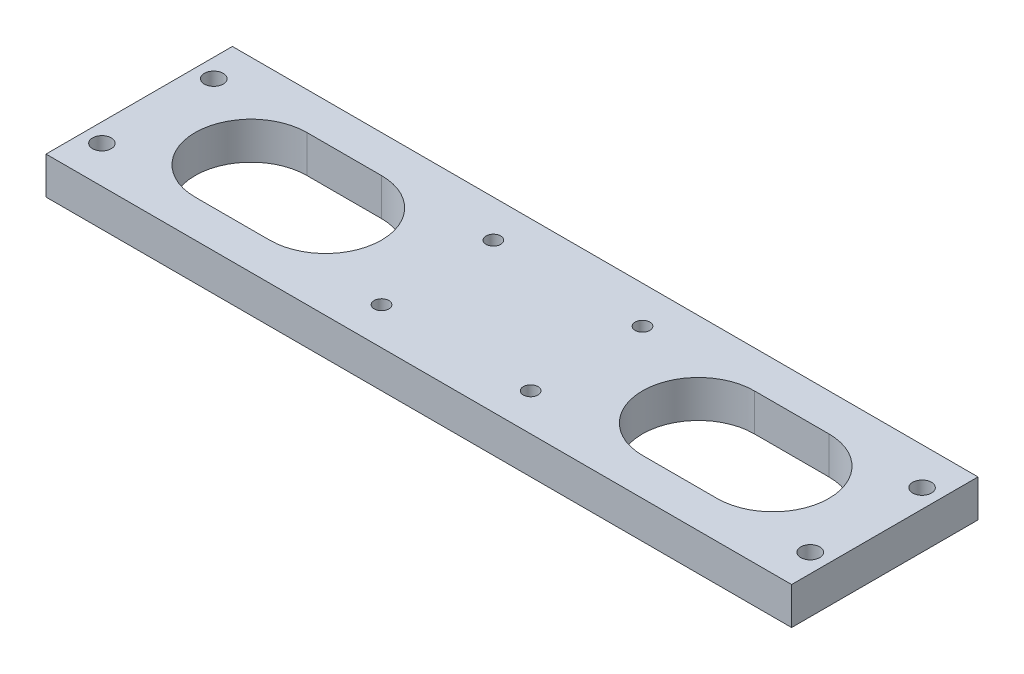
ISO-10303-21;
HEADER;
FILE_DESCRIPTION(('STEP AP214'),'2;1');
FILE_NAME('part.step','',(''),(''),'','','');
FILE_SCHEMA(('AUTOMOTIVE_DESIGN { 1 0 10303 214 1 1 1 1 }'));
ENDSEC;
DATA;
#1=APPLICATION_CONTEXT('core data for automotive mechanical design processes');
#2=APPLICATION_PROTOCOL_DEFINITION('international standard','automotive_design',2000,#1);
#3=PRODUCT_CONTEXT('',#1,'mechanical');
#4=PRODUCT('Part','Part','',(#3));
#5=PRODUCT_RELATED_PRODUCT_CATEGORY('part','',(#4));
#6=PRODUCT_DEFINITION_FORMATION('','',#4);
#7=PRODUCT_DEFINITION_CONTEXT('part definition',#1,'design');
#8=PRODUCT_DEFINITION('design','',#6,#7);
#9=PRODUCT_DEFINITION_SHAPE('','',#8);
#10=(LENGTH_UNIT() NAMED_UNIT(*) SI_UNIT(.MILLI.,.METRE.));
#11=(NAMED_UNIT(*) PLANE_ANGLE_UNIT() SI_UNIT($,.RADIAN.));
#12=(NAMED_UNIT(*) SI_UNIT($,.STERADIAN.) SOLID_ANGLE_UNIT());
#13=UNCERTAINTY_MEASURE_WITH_UNIT(LENGTH_MEASURE(1.E-05),#10,'distance_accuracy_value','');
#14=(GEOMETRIC_REPRESENTATION_CONTEXT(3) GLOBAL_UNCERTAINTY_ASSIGNED_CONTEXT((#13)) GLOBAL_UNIT_ASSIGNED_CONTEXT((#10,
#11,#12)) REPRESENTATION_CONTEXT('',''));
#15=CARTESIAN_POINT('',(0.,0.,0.));
#16=DIRECTION('',(0.,0.,1.));
#17=DIRECTION('',(1.,0.,0.));
#18=AXIS2_PLACEMENT_3D('',#15,#16,#17);
#19=CARTESIAN_POINT('',(0.,-3.175,0.));
#20=DIRECTION('',(0.,-1.,0.));
#21=DIRECTION('',(0.,0.,-1.));
#22=AXIS2_PLACEMENT_3D('',#19,#20,#21);
#23=PLANE('',#22);
#24=CARTESIAN_POINT('',(-44.45,-3.175,0.));
#25=DIRECTION('',(0.,1.,0.));
#26=DIRECTION('',(0.,0.,1.));
#27=AXIS2_PLACEMENT_3D('',#24,#25,#26);
#28=CIRCLE('',#27,9.525);
#29=CARTESIAN_POINT('',(-44.45,-3.175,-9.525));
#30=VERTEX_POINT('',#29);
#31=CARTESIAN_POINT('',(-44.45,-3.175,9.525));
#32=VERTEX_POINT('',#31);
#33=EDGE_CURVE('E135',#30,#32,#28,.T.);
#34=ORIENTED_EDGE('',*,*,#33,.T.);
#35=DIRECTION('',(1.,0.,0.));
#36=VECTOR('',#35,1.);
#37=CARTESIAN_POINT('',(-44.45,-3.175,9.525));
#38=LINE('',#37,#36);
#39=CARTESIAN_POINT('',(-31.75,-3.175,9.525));
#40=VERTEX_POINT('',#39);
#41=EDGE_CURVE('E146',#32,#40,#38,.T.);
#42=ORIENTED_EDGE('',*,*,#41,.T.);
#43=CARTESIAN_POINT('',(-31.75,-3.175,0.));
#44=DIRECTION('',(0.,1.,0.));
#45=DIRECTION('',(0.,0.,1.));
#46=AXIS2_PLACEMENT_3D('',#43,#44,#45);
#47=CIRCLE('',#46,9.525);
#48=CARTESIAN_POINT('',(-31.75,-3.175,-9.525));
#49=VERTEX_POINT('',#48);
#50=EDGE_CURVE('E57',#40,#49,#47,.T.);
#51=ORIENTED_EDGE('',*,*,#50,.T.);
#52=DIRECTION('',(-1.,0.,0.));
#53=VECTOR('',#52,1.);
#54=CARTESIAN_POINT('',(-44.45,-3.175,-9.525));
#55=LINE('',#54,#53);
#56=EDGE_CURVE('E143',#49,#30,#55,.T.);
#57=ORIENTED_EDGE('',*,*,#56,.T.);
#58=EDGE_LOOP('',(#34,#42,#51,#57));
#59=FACE_BOUND('',#58,.T.);
#60=CARTESIAN_POINT('',(44.45,-3.175,0.));
#61=DIRECTION('',(0.,1.,0.));
#62=DIRECTION('',(0.,0.,1.));
#63=AXIS2_PLACEMENT_3D('',#60,#61,#62);
#64=CIRCLE('',#63,9.525);
#65=CARTESIAN_POINT('',(44.45,-3.175,9.525));
#66=VERTEX_POINT('',#65);
#67=CARTESIAN_POINT('',(44.45,-3.175,-9.52500000000001));
#68=VERTEX_POINT('',#67);
#69=EDGE_CURVE('E172',#66,#68,#64,.T.);
#70=ORIENTED_EDGE('',*,*,#69,.T.);
#71=DIRECTION('',(-1.,0.,0.));
#72=VECTOR('',#71,1.);
#73=CARTESIAN_POINT('',(44.45,-3.175,-9.52500000000001));
#74=LINE('',#73,#72);
#75=CARTESIAN_POINT('',(31.75,-3.175,-9.525));
#76=VERTEX_POINT('',#75);
#77=EDGE_CURVE('E175',#68,#76,#74,.T.);
#78=ORIENTED_EDGE('',*,*,#77,.T.);
#79=CARTESIAN_POINT('',(31.75,-3.175,0.));
#80=DIRECTION('',(0.,1.,0.));
#81=DIRECTION('',(0.,0.,1.));
#82=AXIS2_PLACEMENT_3D('',#79,#80,#81);
#83=CIRCLE('',#82,9.525);
#84=CARTESIAN_POINT('',(31.75,-3.175,9.525));
#85=VERTEX_POINT('',#84);
#86=EDGE_CURVE('E65',#76,#85,#83,.T.);
#87=ORIENTED_EDGE('',*,*,#86,.T.);
#88=DIRECTION('',(1.,0.,0.));
#89=VECTOR('',#88,1.);
#90=CARTESIAN_POINT('',(44.45,-3.175,9.525));
#91=LINE('',#90,#89);
#92=EDGE_CURVE('E180',#85,#66,#91,.T.);
#93=ORIENTED_EDGE('',*,*,#92,.T.);
#94=EDGE_LOOP('',(#70,#78,#87,#93));
#95=FACE_BOUND('',#94,.T.);
#96=CARTESIAN_POINT('',(-12.7,-3.175,-9.525));
#97=DIRECTION('',(0.,1.,0.));
#98=DIRECTION('',(0.,0.,1.));
#99=AXIS2_PLACEMENT_3D('',#96,#97,#98);
#100=CIRCLE('',#99,1.25);
#101=CARTESIAN_POINT('',(-12.7,-3.175,-8.275));
#102=VERTEX_POINT('',#101);
#103=EDGE_CURVE('E203',#102,#102,#100,.T.);
#104=ORIENTED_EDGE('',*,*,#103,.T.);
#105=EDGE_LOOP('',(#104));
#106=FACE_BOUND('',#105,.T.);
#107=CARTESIAN_POINT('',(12.7,-3.175,-9.525));
#108=DIRECTION('',(0.,1.,0.));
#109=DIRECTION('',(0.,0.,1.));
#110=AXIS2_PLACEMENT_3D('',#107,#108,#109);
#111=CIRCLE('',#110,1.25);
#112=CARTESIAN_POINT('',(12.7,-3.175,-8.275));
#113=VERTEX_POINT('',#112);
#114=EDGE_CURVE('E209',#113,#113,#111,.T.);
#115=ORIENTED_EDGE('',*,*,#114,.T.);
#116=EDGE_LOOP('',(#115));
#117=FACE_BOUND('',#116,.T.);
#118=DIRECTION('',(0.,0.,-1.));
#119=VECTOR('',#118,1.);
#120=CARTESIAN_POINT('',(63.5,-3.175,15.875));
#121=LINE('',#120,#119);
#122=CARTESIAN_POINT('',(63.5,-3.175,15.875));
#123=VERTEX_POINT('',#122);
#124=CARTESIAN_POINT('',(63.5,-3.175,-15.875));
#125=VERTEX_POINT('',#124);
#126=EDGE_CURVE('E262',#123,#125,#121,.T.);
#127=ORIENTED_EDGE('',*,*,#126,.F.);
#128=DIRECTION('',(1.,0.,0.));
#129=VECTOR('',#128,1.);
#130=CARTESIAN_POINT('',(-63.5,-3.175,15.875));
#131=LINE('',#130,#129);
#132=CARTESIAN_POINT('',(-63.5,-3.175,15.875));
#133=VERTEX_POINT('',#132);
#134=EDGE_CURVE('E255',#133,#123,#131,.T.);
#135=ORIENTED_EDGE('',*,*,#134,.F.);
#136=DIRECTION('',(0.,0.,1.));
#137=VECTOR('',#136,1.);
#138=CARTESIAN_POINT('',(-63.5,-3.175,15.875));
#139=LINE('',#138,#137);
#140=CARTESIAN_POINT('',(-63.5,-3.175,-15.875));
#141=VERTEX_POINT('',#140);
#142=EDGE_CURVE('E267',#141,#133,#139,.T.);
#143=ORIENTED_EDGE('',*,*,#142,.F.);
#144=DIRECTION('',(-1.,0.,0.));
#145=VECTOR('',#144,1.);
#146=CARTESIAN_POINT('',(-63.5,-3.175,-15.875));
#147=LINE('',#146,#145);
#148=EDGE_CURVE('E265',#125,#141,#147,.T.);
#149=ORIENTED_EDGE('',*,*,#148,.F.);
#150=EDGE_LOOP('',(#127,#135,#143,#149));
#151=FACE_BOUND('',#150,.T.);
#152=CARTESIAN_POINT('',(60.325,-3.175,-9.52499999999997));
#153=DIRECTION('',(0.,-1.,0.));
#154=DIRECTION('',(0.,0.,-1.));
#155=AXIS2_PLACEMENT_3D('',#152,#153,#154);
#156=CIRCLE('',#155,3.15);
#157=CARTESIAN_POINT('',(60.325,-3.175,-12.675));
#158=VERTEX_POINT('',#157);
#159=EDGE_CURVE('E244',#158,#158,#156,.T.);
#160=ORIENTED_EDGE('',*,*,#159,.F.);
#161=EDGE_LOOP('',(#160));
#162=FACE_BOUND('',#161,.T.);
#163=CARTESIAN_POINT('',(60.325,-3.175,9.52500000000003));
#164=DIRECTION('',(0.,-1.,0.));
#165=DIRECTION('',(0.,0.,-1.));
#166=AXIS2_PLACEMENT_3D('',#163,#164,#165);
#167=CIRCLE('',#166,3.15000000000001);
#168=CARTESIAN_POINT('',(60.325,-3.175,6.37500000000003));
#169=VERTEX_POINT('',#168);
#170=EDGE_CURVE('E237',#169,#169,#167,.T.);
#171=ORIENTED_EDGE('',*,*,#170,.F.);
#172=EDGE_LOOP('',(#171));
#173=FACE_BOUND('',#172,.T.);
#174=CARTESIAN_POINT('',(-60.325,-3.175,9.52499999999998));
#175=DIRECTION('',(0.,-1.,0.));
#176=DIRECTION('',(0.,0.,-1.));
#177=AXIS2_PLACEMENT_3D('',#174,#175,#176);
#178=CIRCLE('',#177,3.15);
#179=CARTESIAN_POINT('',(-60.325,-3.175,6.37499999999998));
#180=VERTEX_POINT('',#179);
#181=EDGE_CURVE('E230',#180,#180,#178,.T.);
#182=ORIENTED_EDGE('',*,*,#181,.F.);
#183=EDGE_LOOP('',(#182));
#184=FACE_BOUND('',#183,.T.);
#185=CARTESIAN_POINT('',(-60.325,-3.175,-9.52500000000003));
#186=DIRECTION('',(0.,-1.,0.));
#187=DIRECTION('',(0.,0.,-1.));
#188=AXIS2_PLACEMENT_3D('',#185,#186,#187);
#189=CIRCLE('',#188,3.15);
#190=CARTESIAN_POINT('',(-60.325,-3.175,-12.675));
#191=VERTEX_POINT('',#190);
#192=EDGE_CURVE('E224',#191,#191,#189,.T.);
#193=ORIENTED_EDGE('',*,*,#192,.F.);
#194=EDGE_LOOP('',(#193));
#195=FACE_BOUND('',#194,.T.);
#196=CARTESIAN_POINT('',(-12.7,-3.175,9.525));
#197=DIRECTION('',(0.,1.,0.));
#198=DIRECTION('',(0.,0.,1.));
#199=AXIS2_PLACEMENT_3D('',#196,#197,#198);
#200=CIRCLE('',#199,1.25);
#201=CARTESIAN_POINT('',(-12.7,-3.175,10.775));
#202=VERTEX_POINT('',#201);
#203=EDGE_CURVE('E221',#202,#202,#200,.T.);
#204=ORIENTED_EDGE('',*,*,#203,.T.);
#205=EDGE_LOOP('',(#204));
#206=FACE_BOUND('',#205,.T.);
#207=CARTESIAN_POINT('',(12.7,-3.175,9.525));
#208=DIRECTION('',(0.,1.,0.));
#209=DIRECTION('',(0.,0.,1.));
#210=AXIS2_PLACEMENT_3D('',#207,#208,#209);
#211=CIRCLE('',#210,1.25);
#212=CARTESIAN_POINT('',(12.7,-3.175,10.775));
#213=VERTEX_POINT('',#212);
#214=EDGE_CURVE('E215',#213,#213,#211,.T.);
#215=ORIENTED_EDGE('',*,*,#214,.T.);
#216=EDGE_LOOP('',(#215));
#217=FACE_BOUND('',#216,.T.);
#218=ADVANCED_FACE('F40',(#59,#95,#106,#117,#151,#162,#173,#184,#195,#206,#217),#23,.T.);
#219=CARTESIAN_POINT('',(63.5,3.175,15.875));
#220=DIRECTION('',(-1.,0.,0.));
#221=DIRECTION('',(0.,0.,1.));
#222=AXIS2_PLACEMENT_3D('',#219,#220,#221);
#223=PLANE('',#222);
#224=ORIENTED_EDGE('',*,*,#126,.T.);
#225=DIRECTION('',(0.,-1.,0.));
#226=VECTOR('',#225,1.);
#227=CARTESIAN_POINT('',(63.5,3.175,-15.875));
#228=LINE('',#227,#226);
#229=CARTESIAN_POINT('',(63.5,3.175,-15.875));
#230=VERTEX_POINT('',#229);
#231=EDGE_CURVE('E11',#230,#125,#228,.T.);
#232=ORIENTED_EDGE('',*,*,#231,.F.);
#233=DIRECTION('',(0.,0.,-1.));
#234=VECTOR('',#233,1.);
#235=CARTESIAN_POINT('',(63.5,3.175,15.875));
#236=LINE('',#235,#234);
#237=CARTESIAN_POINT('',(63.5,3.175,15.875));
#238=VERTEX_POINT('',#237);
#239=EDGE_CURVE('E251',#238,#230,#236,.T.);
#240=ORIENTED_EDGE('',*,*,#239,.F.);
#241=DIRECTION('',(0.,-1.,0.));
#242=VECTOR('',#241,1.);
#243=CARTESIAN_POINT('',(63.5,3.175,15.875));
#244=LINE('',#243,#242);
#245=EDGE_CURVE('E261',#238,#123,#244,.T.);
#246=ORIENTED_EDGE('',*,*,#245,.T.);
#247=EDGE_LOOP('',(#224,#232,#240,#246));
#248=FACE_BOUND('',#247,.T.);
#249=ADVANCED_FACE('F42',(#248),#223,.F.);
#250=CARTESIAN_POINT('',(-63.5,3.175,-15.875));
#251=DIRECTION('',(0.,0.,1.));
#252=DIRECTION('',(1.,0.,0.));
#253=AXIS2_PLACEMENT_3D('',#250,#251,#252);
#254=PLANE('',#253);
#255=ORIENTED_EDGE('',*,*,#148,.T.);
#256=DIRECTION('',(0.,-1.,0.));
#257=VECTOR('',#256,1.);
#258=CARTESIAN_POINT('',(-63.5,3.175,-15.875));
#259=LINE('',#258,#257);
#260=CARTESIAN_POINT('',(-63.5,3.175,-15.875));
#261=VERTEX_POINT('',#260);
#262=EDGE_CURVE('E49',#261,#141,#259,.T.);
#263=ORIENTED_EDGE('',*,*,#262,.F.);
#264=DIRECTION('',(-1.,0.,0.));
#265=VECTOR('',#264,1.);
#266=CARTESIAN_POINT('',(-63.5,3.175,-15.875));
#267=LINE('',#266,#265);
#268=EDGE_CURVE('E254',#230,#261,#267,.T.);
#269=ORIENTED_EDGE('',*,*,#268,.F.);
#270=ORIENTED_EDGE('',*,*,#231,.T.);
#271=EDGE_LOOP('',(#255,#263,#269,#270));
#272=FACE_BOUND('',#271,.T.);
#273=ADVANCED_FACE('F307',(#272),#254,.F.);
#274=CARTESIAN_POINT('',(-63.5,3.175,15.875));
#275=DIRECTION('',(1.,0.,0.));
#276=DIRECTION('',(0.,0.,-1.));
#277=AXIS2_PLACEMENT_3D('',#274,#275,#276);
#278=PLANE('',#277);
#279=ORIENTED_EDGE('',*,*,#142,.T.);
#280=DIRECTION('',(0.,-1.,0.));
#281=VECTOR('',#280,1.);
#282=CARTESIAN_POINT('',(-63.5,3.175,15.875));
#283=LINE('',#282,#281);
#284=CARTESIAN_POINT('',(-63.5,3.175,15.875));
#285=VERTEX_POINT('',#284);
#286=EDGE_CURVE('E272',#285,#133,#283,.T.);
#287=ORIENTED_EDGE('',*,*,#286,.F.);
#288=DIRECTION('',(0.,0.,1.));
#289=VECTOR('',#288,1.);
#290=CARTESIAN_POINT('',(-63.5,3.175,15.875));
#291=LINE('',#290,#289);
#292=EDGE_CURVE('E257',#261,#285,#291,.T.);
#293=ORIENTED_EDGE('',*,*,#292,.F.);
#294=ORIENTED_EDGE('',*,*,#262,.T.);
#295=EDGE_LOOP('',(#279,#287,#293,#294));
#296=FACE_BOUND('',#295,.T.);
#297=ADVANCED_FACE('F315',(#296),#278,.F.);
#298=CARTESIAN_POINT('',(-63.5,3.175,15.875));
#299=DIRECTION('',(0.,0.,-1.));
#300=DIRECTION('',(-1.,0.,0.));
#301=AXIS2_PLACEMENT_3D('',#298,#299,#300);
#302=PLANE('',#301);
#303=ORIENTED_EDGE('',*,*,#134,.T.);
#304=ORIENTED_EDGE('',*,*,#245,.F.);
#305=DIRECTION('',(1.,0.,0.));
#306=VECTOR('',#305,1.);
#307=CARTESIAN_POINT('',(-63.5,3.175,15.875));
#308=LINE('',#307,#306);
#309=EDGE_CURVE('E259',#285,#238,#308,.T.);
#310=ORIENTED_EDGE('',*,*,#309,.F.);
#311=ORIENTED_EDGE('',*,*,#286,.T.);
#312=EDGE_LOOP('',(#303,#304,#310,#311));
#313=FACE_BOUND('',#312,.T.);
#314=ADVANCED_FACE('F312',(#313),#302,.F.);
#315=CARTESIAN_POINT('',(0.,3.175,0.));
#316=DIRECTION('',(0.,-1.,0.));
#317=DIRECTION('',(0.,0.,-1.));
#318=AXIS2_PLACEMENT_3D('',#315,#316,#317);
#319=PLANE('',#318);
#320=DIRECTION('',(1.,0.,0.));
#321=VECTOR('',#320,1.);
#322=CARTESIAN_POINT('',(-44.45,3.175,9.525));
#323=LINE('',#322,#321);
#324=CARTESIAN_POINT('',(-44.45,3.175,9.525));
#325=VERTEX_POINT('',#324);
#326=CARTESIAN_POINT('',(-31.75,3.175,9.525));
#327=VERTEX_POINT('',#326);
#328=EDGE_CURVE('E161',#325,#327,#323,.T.);
#329=ORIENTED_EDGE('',*,*,#328,.F.);
#330=CARTESIAN_POINT('',(-44.45,3.175,0.));
#331=DIRECTION('',(0.,1.,0.));
#332=DIRECTION('',(0.,0.,1.));
#333=AXIS2_PLACEMENT_3D('',#330,#331,#332);
#334=CIRCLE('',#333,9.525);
#335=CARTESIAN_POINT('',(-44.45,3.175,-9.525));
#336=VERTEX_POINT('',#335);
#337=EDGE_CURVE('E138',#336,#325,#334,.T.);
#338=ORIENTED_EDGE('',*,*,#337,.F.);
#339=DIRECTION('',(-1.,0.,0.));
#340=VECTOR('',#339,1.);
#341=CARTESIAN_POINT('',(-44.45,3.175,-9.525));
#342=LINE('',#341,#340);
#343=CARTESIAN_POINT('',(-31.75,3.175,-9.525));
#344=VERTEX_POINT('',#343);
#345=EDGE_CURVE('E152',#344,#336,#342,.T.);
#346=ORIENTED_EDGE('',*,*,#345,.F.);
#347=CARTESIAN_POINT('',(-31.75,3.175,0.));
#348=DIRECTION('',(0.,1.,0.));
#349=DIRECTION('',(0.,0.,1.));
#350=AXIS2_PLACEMENT_3D('',#347,#348,#349);
#351=CIRCLE('',#350,9.525);
#352=EDGE_CURVE('E155',#327,#344,#351,.T.);
#353=ORIENTED_EDGE('',*,*,#352,.F.);
#354=EDGE_LOOP('',(#329,#338,#346,#353));
#355=FACE_BOUND('',#354,.T.);
#356=DIRECTION('',(-1.,0.,0.));
#357=VECTOR('',#356,1.);
#358=CARTESIAN_POINT('',(44.45,3.175,-9.52500000000001));
#359=LINE('',#358,#357);
#360=CARTESIAN_POINT('',(44.45,3.175,-9.52500000000001));
#361=VERTEX_POINT('',#360);
#362=CARTESIAN_POINT('',(31.75,3.175,-9.525));
#363=VERTEX_POINT('',#362);
#364=EDGE_CURVE('E186',#361,#363,#359,.T.);
#365=ORIENTED_EDGE('',*,*,#364,.F.);
#366=CARTESIAN_POINT('',(44.45,3.175,0.));
#367=DIRECTION('',(0.,1.,0.));
#368=DIRECTION('',(0.,0.,1.));
#369=AXIS2_PLACEMENT_3D('',#366,#367,#368);
#370=CIRCLE('',#369,9.525);
#371=CARTESIAN_POINT('',(44.45,3.175,9.525));
#372=VERTEX_POINT('',#371);
#373=EDGE_CURVE('E184',#372,#361,#370,.T.);
#374=ORIENTED_EDGE('',*,*,#373,.F.);
#375=DIRECTION('',(1.,0.,0.));
#376=VECTOR('',#375,1.);
#377=CARTESIAN_POINT('',(44.45,3.175,9.525));
#378=LINE('',#377,#376);
#379=CARTESIAN_POINT('',(31.75,3.175,9.525));
#380=VERTEX_POINT('',#379);
#381=EDGE_CURVE('E176',#380,#372,#378,.T.);
#382=ORIENTED_EDGE('',*,*,#381,.F.);
#383=CARTESIAN_POINT('',(31.75,3.175,0.));
#384=DIRECTION('',(0.,1.,0.));
#385=DIRECTION('',(0.,0.,1.));
#386=AXIS2_PLACEMENT_3D('',#383,#384,#385);
#387=CIRCLE('',#386,9.525);
#388=EDGE_CURVE('E189',#363,#380,#387,.T.);
#389=ORIENTED_EDGE('',*,*,#388,.F.);
#390=EDGE_LOOP('',(#365,#374,#382,#389));
#391=FACE_BOUND('',#390,.T.);
#392=CARTESIAN_POINT('',(-12.7,3.175,-9.525));
#393=DIRECTION('',(0.,1.,0.));
#394=DIRECTION('',(0.,0.,1.));
#395=AXIS2_PLACEMENT_3D('',#392,#393,#394);
#396=CIRCLE('',#395,1.24999999999999);
#397=CARTESIAN_POINT('',(-12.7,3.175,-8.27500000000001));
#398=VERTEX_POINT('',#397);
#399=EDGE_CURVE('E168',#398,#398,#396,.T.);
#400=ORIENTED_EDGE('',*,*,#399,.F.);
#401=EDGE_LOOP('',(#400));
#402=FACE_BOUND('',#401,.T.);
#403=CARTESIAN_POINT('',(12.7,3.175,-9.525));
#404=DIRECTION('',(0.,1.,0.));
#405=DIRECTION('',(0.,0.,1.));
#406=AXIS2_PLACEMENT_3D('',#403,#404,#405);
#407=CIRCLE('',#406,1.24999999999999);
#408=CARTESIAN_POINT('',(12.7,3.175,-8.27500000000001));
#409=VERTEX_POINT('',#408);
#410=EDGE_CURVE('E206',#409,#409,#407,.T.);
#411=ORIENTED_EDGE('',*,*,#410,.F.);
#412=EDGE_LOOP('',(#411));
#413=FACE_BOUND('',#412,.T.);
#414=CARTESIAN_POINT('',(12.7,3.175,9.525));
#415=DIRECTION('',(0.,1.,0.));
#416=DIRECTION('',(0.,0.,1.));
#417=AXIS2_PLACEMENT_3D('',#414,#415,#416);
#418=CIRCLE('',#417,1.24999999999999);
#419=CARTESIAN_POINT('',(12.7,3.175,10.775));
#420=VERTEX_POINT('',#419);
#421=EDGE_CURVE('E212',#420,#420,#418,.T.);
#422=ORIENTED_EDGE('',*,*,#421,.F.);
#423=EDGE_LOOP('',(#422));
#424=FACE_BOUND('',#423,.T.);
#425=CARTESIAN_POINT('',(-12.7,3.175,9.525));
#426=DIRECTION('',(0.,1.,0.));
#427=DIRECTION('',(0.,0.,1.));
#428=AXIS2_PLACEMENT_3D('',#425,#426,#427);
#429=CIRCLE('',#428,1.24999999999999);
#430=CARTESIAN_POINT('',(-12.7,3.175,10.775));
#431=VERTEX_POINT('',#430);
#432=EDGE_CURVE('E218',#431,#431,#429,.T.);
#433=ORIENTED_EDGE('',*,*,#432,.F.);
#434=EDGE_LOOP('',(#433));
#435=FACE_BOUND('',#434,.T.);
#436=CARTESIAN_POINT('',(-60.325,3.175,-9.52500000000003));
#437=DIRECTION('',(0.,-1.,0.));
#438=DIRECTION('',(0.,0.,-1.));
#439=AXIS2_PLACEMENT_3D('',#436,#437,#438);
#440=CIRCLE('',#439,1.6);
#441=CARTESIAN_POINT('',(-60.325,3.175,-11.125));
#442=VERTEX_POINT('',#441);
#443=EDGE_CURVE('E44',#442,#442,#440,.T.);
#444=ORIENTED_EDGE('',*,*,#443,.T.);
#445=EDGE_LOOP('',(#444));
#446=FACE_BOUND('',#445,.T.);
#447=CARTESIAN_POINT('',(-60.325,3.175,9.52499999999998));
#448=DIRECTION('',(0.,-1.,0.));
#449=DIRECTION('',(0.,0.,-1.));
#450=AXIS2_PLACEMENT_3D('',#447,#448,#449);
#451=CIRCLE('',#450,1.6);
#452=CARTESIAN_POINT('',(-60.325,3.175,7.92499999999998));
#453=VERTEX_POINT('',#452);
#454=EDGE_CURVE('E236',#453,#453,#451,.T.);
#455=ORIENTED_EDGE('',*,*,#454,.T.);
#456=EDGE_LOOP('',(#455));
#457=FACE_BOUND('',#456,.T.);
#458=CARTESIAN_POINT('',(60.325,3.175,9.52500000000003));
#459=DIRECTION('',(0.,-1.,0.));
#460=DIRECTION('',(0.,0.,-1.));
#461=AXIS2_PLACEMENT_3D('',#458,#459,#460);
#462=CIRCLE('',#461,1.6);
#463=CARTESIAN_POINT('',(60.325,3.175,7.92500000000004));
#464=VERTEX_POINT('',#463);
#465=EDGE_CURVE('E243',#464,#464,#462,.T.);
#466=ORIENTED_EDGE('',*,*,#465,.T.);
#467=EDGE_LOOP('',(#466));
#468=FACE_BOUND('',#467,.T.);
#469=CARTESIAN_POINT('',(60.325,3.175,-9.52499999999997));
#470=DIRECTION('',(0.,-1.,0.));
#471=DIRECTION('',(0.,0.,-1.));
#472=AXIS2_PLACEMENT_3D('',#469,#470,#471);
#473=CIRCLE('',#472,1.6);
#474=CARTESIAN_POINT('',(60.325,3.175,-11.125));
#475=VERTEX_POINT('',#474);
#476=EDGE_CURVE('E250',#475,#475,#473,.T.);
#477=ORIENTED_EDGE('',*,*,#476,.T.);
#478=EDGE_LOOP('',(#477));
#479=FACE_BOUND('',#478,.T.);
#480=ORIENTED_EDGE('',*,*,#239,.T.);
#481=ORIENTED_EDGE('',*,*,#268,.T.);
#482=ORIENTED_EDGE('',*,*,#292,.T.);
#483=ORIENTED_EDGE('',*,*,#309,.T.);
#484=EDGE_LOOP('',(#480,#481,#482,#483));
#485=FACE_BOUND('',#484,.T.);
#486=ADVANCED_FACE('F283',(#355,#391,#402,#413,#424,#435,#446,#457,#468,#479,#485),#319,.F.);
#487=CARTESIAN_POINT('',(60.325,-3.175,-9.52499999999997));
#488=DIRECTION('',(0.,-1.,0.));
#489=DIRECTION('',(0.,0.,-1.));
#490=AXIS2_PLACEMENT_3D('',#487,#488,#489);
#491=CYLINDRICAL_SURFACE('',#490,1.6);
#492=CARTESIAN_POINT('',(60.325,-1.625,-9.52499999999997));
#493=DIRECTION('',(0.,-1.,0.));
#494=DIRECTION('',(0.,0.,-1.));
#495=AXIS2_PLACEMENT_3D('',#492,#493,#494);
#496=CIRCLE('',#495,1.6);
#497=CARTESIAN_POINT('',(60.325,-1.625,-11.125));
#498=VERTEX_POINT('',#497);
#499=EDGE_CURVE('E247',#498,#498,#496,.T.);
#500=ORIENTED_EDGE('',*,*,#499,.T.);
#501=EDGE_LOOP('',(#500));
#502=FACE_BOUND('',#501,.T.);
#503=ORIENTED_EDGE('',*,*,#476,.F.);
#504=EDGE_LOOP('',(#503));
#505=FACE_BOUND('',#504,.T.);
#506=ADVANCED_FACE('F337',(#502,#505),#491,.F.);
#507=CARTESIAN_POINT('',(60.325,-3.175,-9.52499999999997));
#508=DIRECTION('',(0.,-1.,0.));
#509=DIRECTION('',(0.,0.,-1.));
#510=AXIS2_PLACEMENT_3D('',#507,#508,#509);
#511=CONICAL_SURFACE('',#510,3.15,0.785398163397448);
#512=ORIENTED_EDGE('',*,*,#499,.F.);
#513=EDGE_LOOP('',(#512));
#514=FACE_BOUND('',#513,.T.);
#515=ORIENTED_EDGE('',*,*,#159,.T.);
#516=EDGE_LOOP('',(#515));
#517=FACE_BOUND('',#516,.T.);
#518=ADVANCED_FACE('F342',(#514,#517),#511,.F.);
#519=CARTESIAN_POINT('',(60.325,-3.175,9.52500000000003));
#520=DIRECTION('',(0.,-1.,0.));
#521=DIRECTION('',(0.,0.,-1.));
#522=AXIS2_PLACEMENT_3D('',#519,#520,#521);
#523=CYLINDRICAL_SURFACE('',#522,1.6);
#524=CARTESIAN_POINT('',(60.325,-1.625,9.52500000000003));
#525=DIRECTION('',(0.,-1.,0.));
#526=DIRECTION('',(0.,0.,-1.));
#527=AXIS2_PLACEMENT_3D('',#524,#525,#526);
#528=CIRCLE('',#527,1.6);
#529=CARTESIAN_POINT('',(60.325,-1.625,7.92500000000004));
#530=VERTEX_POINT('',#529);
#531=EDGE_CURVE('E240',#530,#530,#528,.T.);
#532=ORIENTED_EDGE('',*,*,#531,.T.);
#533=EDGE_LOOP('',(#532));
#534=FACE_BOUND('',#533,.T.);
#535=ORIENTED_EDGE('',*,*,#465,.F.);
#536=EDGE_LOOP('',(#535));
#537=FACE_BOUND('',#536,.T.);
#538=ADVANCED_FACE('F299',(#534,#537),#523,.F.);
#539=CARTESIAN_POINT('',(60.325,-3.175,9.52500000000003));
#540=DIRECTION('',(0.,-1.,0.));
#541=DIRECTION('',(0.,0.,-1.));
#542=AXIS2_PLACEMENT_3D('',#539,#540,#541);
#543=CONICAL_SURFACE('',#542,3.15000000000001,0.78539816339745);
#544=ORIENTED_EDGE('',*,*,#531,.F.);
#545=EDGE_LOOP('',(#544));
#546=FACE_BOUND('',#545,.T.);
#547=ORIENTED_EDGE('',*,*,#170,.T.);
#548=EDGE_LOOP('',(#547));
#549=FACE_BOUND('',#548,.T.);
#550=ADVANCED_FACE('F289',(#546,#549),#543,.F.);
#551=CARTESIAN_POINT('',(-60.325,-3.175,9.52499999999998));
#552=DIRECTION('',(0.,-1.,0.));
#553=DIRECTION('',(0.,0.,-1.));
#554=AXIS2_PLACEMENT_3D('',#551,#552,#553);
#555=CYLINDRICAL_SURFACE('',#554,1.6);
#556=CARTESIAN_POINT('',(-60.325,-1.625,9.52499999999998));
#557=DIRECTION('',(0.,-1.,0.));
#558=DIRECTION('',(0.,0.,-1.));
#559=AXIS2_PLACEMENT_3D('',#556,#557,#558);
#560=CIRCLE('',#559,1.6);
#561=CARTESIAN_POINT('',(-60.325,-1.625,7.92499999999998));
#562=VERTEX_POINT('',#561);
#563=EDGE_CURVE('E233',#562,#562,#560,.T.);
#564=ORIENTED_EDGE('',*,*,#563,.T.);
#565=EDGE_LOOP('',(#564));
#566=FACE_BOUND('',#565,.T.);
#567=ORIENTED_EDGE('',*,*,#454,.F.);
#568=EDGE_LOOP('',(#567));
#569=FACE_BOUND('',#568,.T.);
#570=ADVANCED_FACE('F286',(#566,#569),#555,.F.);
#571=CARTESIAN_POINT('',(-60.325,-3.175,9.52499999999998));
#572=DIRECTION('',(0.,-1.,0.));
#573=DIRECTION('',(0.,0.,-1.));
#574=AXIS2_PLACEMENT_3D('',#571,#572,#573);
#575=CONICAL_SURFACE('',#574,3.15,0.785398163397448);
#576=ORIENTED_EDGE('',*,*,#563,.F.);
#577=EDGE_LOOP('',(#576));
#578=FACE_BOUND('',#577,.T.);
#579=ORIENTED_EDGE('',*,*,#181,.T.);
#580=EDGE_LOOP('',(#579));
#581=FACE_BOUND('',#580,.T.);
#582=ADVANCED_FACE('F288',(#578,#581),#575,.F.);
#583=CARTESIAN_POINT('',(-60.325,-3.175,-9.52500000000003));
#584=DIRECTION('',(0.,-1.,0.));
#585=DIRECTION('',(0.,0.,-1.));
#586=AXIS2_PLACEMENT_3D('',#583,#584,#585);
#587=CYLINDRICAL_SURFACE('',#586,1.6);
#588=CARTESIAN_POINT('',(-60.325,-1.625,-9.52500000000003));
#589=DIRECTION('',(0.,-1.,0.));
#590=DIRECTION('',(0.,0.,-1.));
#591=AXIS2_PLACEMENT_3D('',#588,#589,#590);
#592=CIRCLE('',#591,1.6);
#593=CARTESIAN_POINT('',(-60.325,-1.625,-11.125));
#594=VERTEX_POINT('',#593);
#595=EDGE_CURVE('E227',#594,#594,#592,.T.);
#596=ORIENTED_EDGE('',*,*,#595,.T.);
#597=EDGE_LOOP('',(#596));
#598=FACE_BOUND('',#597,.T.);
#599=ORIENTED_EDGE('',*,*,#443,.F.);
#600=EDGE_LOOP('',(#599));
#601=FACE_BOUND('',#600,.T.);
#602=ADVANCED_FACE('F296',(#598,#601),#587,.F.);
#603=CARTESIAN_POINT('',(-60.325,-3.175,-9.52500000000003));
#604=DIRECTION('',(0.,-1.,0.));
#605=DIRECTION('',(0.,0.,-1.));
#606=AXIS2_PLACEMENT_3D('',#603,#604,#605);
#607=CONICAL_SURFACE('',#606,3.15,0.785398163397448);
#608=ORIENTED_EDGE('',*,*,#595,.F.);
#609=EDGE_LOOP('',(#608));
#610=FACE_BOUND('',#609,.T.);
#611=ORIENTED_EDGE('',*,*,#192,.T.);
#612=EDGE_LOOP('',(#611));
#613=FACE_BOUND('',#612,.T.);
#614=ADVANCED_FACE('F362',(#610,#613),#607,.F.);
#615=CARTESIAN_POINT('',(-12.7,3.175,9.525));
#616=DIRECTION('',(0.,1.,0.));
#617=DIRECTION('',(0.,0.,1.));
#618=AXIS2_PLACEMENT_3D('',#615,#616,#617);
#619=CYLINDRICAL_SURFACE('',#618,1.24999999999999);
#620=ORIENTED_EDGE('',*,*,#203,.F.);
#621=EDGE_LOOP('',(#620));
#622=FACE_BOUND('',#621,.T.);
#623=ORIENTED_EDGE('',*,*,#432,.T.);
#624=EDGE_LOOP('',(#623));
#625=FACE_BOUND('',#624,.T.);
#626=ADVANCED_FACE('F368',(#622,#625),#619,.F.);
#627=CARTESIAN_POINT('',(12.7,3.175,9.525));
#628=DIRECTION('',(0.,1.,0.));
#629=DIRECTION('',(0.,0.,1.));
#630=AXIS2_PLACEMENT_3D('',#627,#628,#629);
#631=CYLINDRICAL_SURFACE('',#630,1.24999999999999);
#632=ORIENTED_EDGE('',*,*,#214,.F.);
#633=EDGE_LOOP('',(#632));
#634=FACE_BOUND('',#633,.T.);
#635=ORIENTED_EDGE('',*,*,#421,.T.);
#636=EDGE_LOOP('',(#635));
#637=FACE_BOUND('',#636,.T.);
#638=ADVANCED_FACE('F374',(#634,#637),#631,.F.);
#639=CARTESIAN_POINT('',(12.7,3.175,-9.525));
#640=DIRECTION('',(0.,1.,0.));
#641=DIRECTION('',(0.,0.,1.));
#642=AXIS2_PLACEMENT_3D('',#639,#640,#641);
#643=CYLINDRICAL_SURFACE('',#642,1.24999999999999);
#644=ORIENTED_EDGE('',*,*,#114,.F.);
#645=EDGE_LOOP('',(#644));
#646=FACE_BOUND('',#645,.T.);
#647=ORIENTED_EDGE('',*,*,#410,.T.);
#648=EDGE_LOOP('',(#647));
#649=FACE_BOUND('',#648,.T.);
#650=ADVANCED_FACE('F378',(#646,#649),#643,.F.);
#651=CARTESIAN_POINT('',(-12.7,3.175,-9.525));
#652=DIRECTION('',(0.,1.,0.));
#653=DIRECTION('',(0.,0.,1.));
#654=AXIS2_PLACEMENT_3D('',#651,#652,#653);
#655=CYLINDRICAL_SURFACE('',#654,1.24999999999999);
#656=ORIENTED_EDGE('',*,*,#103,.F.);
#657=EDGE_LOOP('',(#656));
#658=FACE_BOUND('',#657,.T.);
#659=ORIENTED_EDGE('',*,*,#399,.T.);
#660=EDGE_LOOP('',(#659));
#661=FACE_BOUND('',#660,.T.);
#662=ADVANCED_FACE('F382',(#658,#661),#655,.F.);
#663=CARTESIAN_POINT('',(44.45,-3.175,0.));
#664=DIRECTION('',(0.,1.,0.));
#665=DIRECTION('',(0.,0.,1.));
#666=AXIS2_PLACEMENT_3D('',#663,#664,#665);
#667=CYLINDRICAL_SURFACE('',#666,9.525);
#668=ORIENTED_EDGE('',*,*,#373,.T.);
#669=DIRECTION('',(0.,1.,0.));
#670=VECTOR('',#669,1.);
#671=CARTESIAN_POINT('',(44.45,-3.175,-9.52500000000001));
#672=LINE('',#671,#670);
#673=EDGE_CURVE('E183',#68,#361,#672,.T.);
#674=ORIENTED_EDGE('',*,*,#673,.F.);
#675=ORIENTED_EDGE('',*,*,#69,.F.);
#676=DIRECTION('',(0.,1.,0.));
#677=VECTOR('',#676,1.);
#678=CARTESIAN_POINT('',(44.45,-3.175,9.525));
#679=LINE('',#678,#677);
#680=EDGE_CURVE('E162',#66,#372,#679,.T.);
#681=ORIENTED_EDGE('',*,*,#680,.T.);
#682=EDGE_LOOP('',(#668,#674,#675,#681));
#683=FACE_BOUND('',#682,.T.);
#684=ADVANCED_FACE('F386',(#683),#667,.F.);
#685=CARTESIAN_POINT('',(44.45,-3.175,9.525));
#686=DIRECTION('',(0.,0.,1.));
#687=DIRECTION('',(1.,0.,0.));
#688=AXIS2_PLACEMENT_3D('',#685,#686,#687);
#689=PLANE('',#688);
#690=ORIENTED_EDGE('',*,*,#381,.T.);
#691=ORIENTED_EDGE('',*,*,#680,.F.);
#692=ORIENTED_EDGE('',*,*,#92,.F.);
#693=DIRECTION('',(0.,1.,0.));
#694=VECTOR('',#693,1.);
#695=CARTESIAN_POINT('',(31.75,-3.175,9.525));
#696=LINE('',#695,#694);
#697=EDGE_CURVE('E195',#85,#380,#696,.T.);
#698=ORIENTED_EDGE('',*,*,#697,.T.);
#699=EDGE_LOOP('',(#690,#691,#692,#698));
#700=FACE_BOUND('',#699,.T.);
#701=ADVANCED_FACE('F390',(#700),#689,.F.);
#702=CARTESIAN_POINT('',(31.75,-3.175,0.));
#703=DIRECTION('',(0.,1.,0.));
#704=DIRECTION('',(0.,0.,1.));
#705=AXIS2_PLACEMENT_3D('',#702,#703,#704);
#706=CYLINDRICAL_SURFACE('',#705,9.525);
#707=ORIENTED_EDGE('',*,*,#388,.T.);
#708=ORIENTED_EDGE('',*,*,#697,.F.);
#709=ORIENTED_EDGE('',*,*,#86,.F.);
#710=DIRECTION('',(0.,1.,0.));
#711=VECTOR('',#710,1.);
#712=CARTESIAN_POINT('',(31.75,-3.175,-9.525));
#713=LINE('',#712,#711);
#714=EDGE_CURVE('E197',#76,#363,#713,.T.);
#715=ORIENTED_EDGE('',*,*,#714,.T.);
#716=EDGE_LOOP('',(#707,#708,#709,#715));
#717=FACE_BOUND('',#716,.T.);
#718=ADVANCED_FACE('F395',(#717),#706,.F.);
#719=CARTESIAN_POINT('',(44.45,-3.175,-9.52500000000001));
#720=DIRECTION('',(0.,0.,-1.));
#721=DIRECTION('',(-1.,0.,0.));
#722=AXIS2_PLACEMENT_3D('',#719,#720,#721);
#723=PLANE('',#722);
#724=ORIENTED_EDGE('',*,*,#364,.T.);
#725=ORIENTED_EDGE('',*,*,#714,.F.);
#726=ORIENTED_EDGE('',*,*,#77,.F.);
#727=ORIENTED_EDGE('',*,*,#673,.T.);
#728=EDGE_LOOP('',(#724,#725,#726,#727));
#729=FACE_BOUND('',#728,.T.);
#730=ADVANCED_FACE('F392',(#729),#723,.F.);
#731=CARTESIAN_POINT('',(-44.45,-3.175,0.));
#732=DIRECTION('',(0.,1.,0.));
#733=DIRECTION('',(0.,0.,1.));
#734=AXIS2_PLACEMENT_3D('',#731,#732,#733);
#735=CYLINDRICAL_SURFACE('',#734,9.525);
#736=ORIENTED_EDGE('',*,*,#337,.T.);
#737=DIRECTION('',(0.,1.,0.));
#738=VECTOR('',#737,1.);
#739=CARTESIAN_POINT('',(-44.45,-3.175,9.525));
#740=LINE('',#739,#738);
#741=EDGE_CURVE('E131',#32,#325,#740,.T.);
#742=ORIENTED_EDGE('',*,*,#741,.F.);
#743=ORIENTED_EDGE('',*,*,#33,.F.);
#744=DIRECTION('',(0.,1.,0.));
#745=VECTOR('',#744,1.);
#746=CARTESIAN_POINT('',(-44.45,-3.175,-9.525));
#747=LINE('',#746,#745);
#748=EDGE_CURVE('E166',#30,#336,#747,.T.);
#749=ORIENTED_EDGE('',*,*,#748,.T.);
#750=EDGE_LOOP('',(#736,#742,#743,#749));
#751=FACE_BOUND('',#750,.T.);
#752=ADVANCED_FACE('F133',(#751),#735,.F.);
#753=CARTESIAN_POINT('',(-44.45,-3.175,-9.525));
#754=DIRECTION('',(0.,0.,-1.));
#755=DIRECTION('',(-1.,0.,0.));
#756=AXIS2_PLACEMENT_3D('',#753,#754,#755);
#757=PLANE('',#756);
#758=ORIENTED_EDGE('',*,*,#345,.T.);
#759=ORIENTED_EDGE('',*,*,#748,.F.);
#760=ORIENTED_EDGE('',*,*,#56,.F.);
#761=DIRECTION('',(0.,1.,0.));
#762=VECTOR('',#761,1.);
#763=CARTESIAN_POINT('',(-31.75,-3.175,-9.525));
#764=LINE('',#763,#762);
#765=EDGE_CURVE('E169',#49,#344,#764,.T.);
#766=ORIENTED_EDGE('',*,*,#765,.T.);
#767=EDGE_LOOP('',(#758,#759,#760,#766));
#768=FACE_BOUND('',#767,.T.);
#769=ADVANCED_FACE('F404',(#768),#757,.F.);
#770=CARTESIAN_POINT('',(-31.75,-3.175,0.));
#771=DIRECTION('',(0.,1.,0.));
#772=DIRECTION('',(0.,0.,1.));
#773=AXIS2_PLACEMENT_3D('',#770,#771,#772);
#774=CYLINDRICAL_SURFACE('',#773,9.525);
#775=ORIENTED_EDGE('',*,*,#352,.T.);
#776=ORIENTED_EDGE('',*,*,#765,.F.);
#777=ORIENTED_EDGE('',*,*,#50,.F.);
#778=DIRECTION('',(0.,1.,0.));
#779=VECTOR('',#778,1.);
#780=CARTESIAN_POINT('',(-31.75,-3.175,9.525));
#781=LINE('',#780,#779);
#782=EDGE_CURVE('E142',#40,#327,#781,.T.);
#783=ORIENTED_EDGE('',*,*,#782,.T.);
#784=EDGE_LOOP('',(#775,#776,#777,#783));
#785=FACE_BOUND('',#784,.T.);
#786=ADVANCED_FACE('F407',(#785),#774,.F.);
#787=CARTESIAN_POINT('',(-44.45,-3.175,9.525));
#788=DIRECTION('',(0.,0.,1.));
#789=DIRECTION('',(1.,0.,0.));
#790=AXIS2_PLACEMENT_3D('',#787,#788,#789);
#791=PLANE('',#790);
#792=ORIENTED_EDGE('',*,*,#328,.T.);
#793=ORIENTED_EDGE('',*,*,#782,.F.);
#794=ORIENTED_EDGE('',*,*,#41,.F.);
#795=ORIENTED_EDGE('',*,*,#741,.T.);
#796=EDGE_LOOP('',(#792,#793,#794,#795));
#797=FACE_BOUND('',#796,.T.);
#798=ADVANCED_FACE('F147',(#797),#791,.F.);
#799=CLOSED_SHELL('',(#218,#249,#273,#297,#314,#486,#506,#518,#538,#550,#570,#582,#602,#614,
#626,#638,#650,#662,#684,#701,#718,#730,#752,#769,#786,#798));
#800=MANIFOLD_SOLID_BREP('B2',#799);
#801=ADVANCED_BREP_SHAPE_REPRESENTATION('',(#18,#800),#14);
#802=SHAPE_DEFINITION_REPRESENTATION(#9,#801);
ENDSEC;
END-ISO-10303-21;
